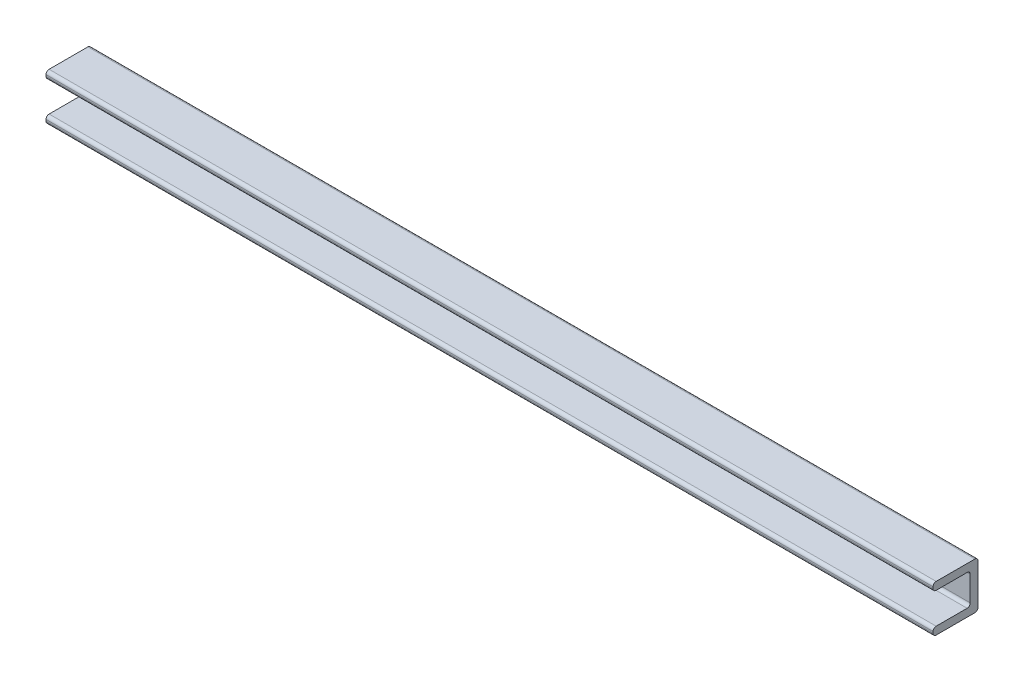
ISO-10303-21;
HEADER;
FILE_DESCRIPTION(('STEP AP214'),'2;1');
FILE_NAME('part.step','',(''),(''),'','','');
FILE_SCHEMA(('AUTOMOTIVE_DESIGN { 1 0 10303 214 1 1 1 1 }'));
ENDSEC;
DATA;
#1=APPLICATION_CONTEXT('core data for automotive mechanical design processes');
#2=APPLICATION_PROTOCOL_DEFINITION('international standard','automotive_design',2000,#1);
#3=PRODUCT_CONTEXT('',#1,'mechanical');
#4=PRODUCT('Part','Part','',(#3));
#5=PRODUCT_RELATED_PRODUCT_CATEGORY('part','',(#4));
#6=PRODUCT_DEFINITION_FORMATION('','',#4);
#7=PRODUCT_DEFINITION_CONTEXT('part definition',#1,'design');
#8=PRODUCT_DEFINITION('design','',#6,#7);
#9=PRODUCT_DEFINITION_SHAPE('','',#8);
#10=(LENGTH_UNIT() NAMED_UNIT(*) SI_UNIT(.MILLI.,.METRE.));
#11=(NAMED_UNIT(*) PLANE_ANGLE_UNIT() SI_UNIT($,.RADIAN.));
#12=(NAMED_UNIT(*) SI_UNIT($,.STERADIAN.) SOLID_ANGLE_UNIT());
#13=UNCERTAINTY_MEASURE_WITH_UNIT(LENGTH_MEASURE(1.E-05),#10,'distance_accuracy_value','');
#14=(GEOMETRIC_REPRESENTATION_CONTEXT(3) GLOBAL_UNCERTAINTY_ASSIGNED_CONTEXT((#13)) GLOBAL_UNIT_ASSIGNED_CONTEXT((#10,
#11,#12)) REPRESENTATION_CONTEXT('',''));
#15=CARTESIAN_POINT('',(0.,0.,0.));
#16=DIRECTION('',(0.,0.,1.));
#17=DIRECTION('',(1.,0.,0.));
#18=AXIS2_PLACEMENT_3D('',#15,#16,#17);
#19=CARTESIAN_POINT('',(602.,8.00000000000133,-188.));
#20=DIRECTION('',(-1.,0.,0.));
#21=DIRECTION('',(0.,0.,1.));
#22=AXIS2_PLACEMENT_3D('',#19,#20,#21);
#23=CYLINDRICAL_SURFACE('',#22,2.);
#24=CARTESIAN_POINT('',(30.,8.00000000000133,-188.));
#25=DIRECTION('',(-1.,0.,0.));
#26=DIRECTION('',(0.,0.,-1.));
#27=AXIS2_PLACEMENT_3D('',#24,#25,#26);
#28=CIRCLE('',#27,2.);
#29=CARTESIAN_POINT('',(30.,10.0000000000013,-188.));
#30=VERTEX_POINT('',#29);
#31=CARTESIAN_POINT('',(30.,8.00000000000133,-190.));
#32=VERTEX_POINT('',#31);
#33=EDGE_CURVE('E188',#30,#32,#28,.T.);
#34=ORIENTED_EDGE('',*,*,#33,.T.);
#35=DIRECTION('',(-1.,0.,0.));
#36=VECTOR('',#35,1.);
#37=CARTESIAN_POINT('',(602.,8.00000000000133,-190.));
#38=LINE('',#37,#36);
#39=CARTESIAN_POINT('',(602.,8.00000000000133,-190.));
#40=VERTEX_POINT('',#39);
#41=EDGE_CURVE('E11',#40,#32,#38,.T.);
#42=ORIENTED_EDGE('',*,*,#41,.F.);
#43=CARTESIAN_POINT('',(602.,8.00000000000133,-188.));
#44=DIRECTION('',(-1.,0.,0.));
#45=DIRECTION('',(0.,0.,-1.));
#46=AXIS2_PLACEMENT_3D('',#43,#44,#45);
#47=CIRCLE('',#46,2.);
#48=CARTESIAN_POINT('',(602.,10.0000000000013,-188.));
#49=VERTEX_POINT('',#48);
#50=EDGE_CURVE('E234',#49,#40,#47,.T.);
#51=ORIENTED_EDGE('',*,*,#50,.F.);
#52=DIRECTION('',(-1.,0.,0.));
#53=VECTOR('',#52,1.);
#54=CARTESIAN_POINT('',(602.,10.0000000000013,-188.));
#55=LINE('',#54,#53);
#56=EDGE_CURVE('E184',#49,#30,#55,.T.);
#57=ORIENTED_EDGE('',*,*,#56,.T.);
#58=EDGE_LOOP('',(#34,#42,#51,#57));
#59=FACE_BOUND('',#58,.T.);
#60=ADVANCED_FACE('F38',(#59),#23,.F.);
#61=CARTESIAN_POINT('',(602.,8.00000000000133,-190.));
#62=DIRECTION('',(0.,0.,-1.));
#63=DIRECTION('',(0.,1.,0.));
#64=AXIS2_PLACEMENT_3D('',#61,#62,#63);
#65=PLANE('',#64);
#66=DIRECTION('',(0.,-1.,0.));
#67=VECTOR('',#66,1.);
#68=CARTESIAN_POINT('',(30.,8.00000000000133,-190.));
#69=LINE('',#68,#67);
#70=CARTESIAN_POINT('',(30.,-7.99999999999866,-190.));
#71=VERTEX_POINT('',#70);
#72=EDGE_CURVE('E192',#32,#71,#69,.T.);
#73=ORIENTED_EDGE('',*,*,#72,.T.);
#74=DIRECTION('',(-1.,0.,0.));
#75=VECTOR('',#74,1.);
#76=CARTESIAN_POINT('',(602.,-7.99999999999866,-190.));
#77=LINE('',#76,#75);
#78=CARTESIAN_POINT('',(602.,-7.99999999999866,-190.));
#79=VERTEX_POINT('',#78);
#80=EDGE_CURVE('E47',#79,#71,#77,.T.);
#81=ORIENTED_EDGE('',*,*,#80,.F.);
#82=DIRECTION('',(0.,-1.,0.));
#83=VECTOR('',#82,1.);
#84=CARTESIAN_POINT('',(602.,8.00000000000133,-190.));
#85=LINE('',#84,#83);
#86=EDGE_CURVE('E122',#40,#79,#85,.T.);
#87=ORIENTED_EDGE('',*,*,#86,.F.);
#88=ORIENTED_EDGE('',*,*,#41,.T.);
#89=EDGE_LOOP('',(#73,#81,#87,#88));
#90=FACE_BOUND('',#89,.T.);
#91=ADVANCED_FACE('F367',(#90),#65,.F.);
#92=CARTESIAN_POINT('',(602.,-7.99999999999866,-188.));
#93=DIRECTION('',(-1.,0.,0.));
#94=DIRECTION('',(0.,0.,1.));
#95=AXIS2_PLACEMENT_3D('',#92,#93,#94);
#96=CYLINDRICAL_SURFACE('',#95,2.);
#97=CARTESIAN_POINT('',(30.,-7.99999999999866,-188.));
#98=DIRECTION('',(-1.,0.,0.));
#99=DIRECTION('',(0.,0.,-1.));
#100=AXIS2_PLACEMENT_3D('',#97,#98,#99);
#101=CIRCLE('',#100,2.);
#102=CARTESIAN_POINT('',(30.,-9.99999999999867,-188.));
#103=VERTEX_POINT('',#102);
#104=EDGE_CURVE('E195',#71,#103,#101,.T.);
#105=ORIENTED_EDGE('',*,*,#104,.T.);
#106=DIRECTION('',(-1.,0.,0.));
#107=VECTOR('',#106,1.);
#108=CARTESIAN_POINT('',(602.,-9.99999999999867,-188.));
#109=LINE('',#108,#107);
#110=CARTESIAN_POINT('',(602.,-9.99999999999867,-188.));
#111=VERTEX_POINT('',#110);
#112=EDGE_CURVE('E277',#111,#103,#109,.T.);
#113=ORIENTED_EDGE('',*,*,#112,.F.);
#114=CARTESIAN_POINT('',(602.,-7.99999999999866,-188.));
#115=DIRECTION('',(-1.,0.,0.));
#116=DIRECTION('',(0.,0.,-1.));
#117=AXIS2_PLACEMENT_3D('',#114,#115,#116);
#118=CIRCLE('',#117,2.);
#119=EDGE_CURVE('E288',#79,#111,#118,.T.);
#120=ORIENTED_EDGE('',*,*,#119,.F.);
#121=ORIENTED_EDGE('',*,*,#80,.T.);
#122=EDGE_LOOP('',(#105,#113,#120,#121));
#123=FACE_BOUND('',#122,.T.);
#124=ADVANCED_FACE('F286',(#123),#96,.F.);
#125=CARTESIAN_POINT('',(602.,-9.99999999999867,-188.));
#126=DIRECTION('',(0.,-1.,0.));
#127=DIRECTION('',(0.,0.,-1.));
#128=AXIS2_PLACEMENT_3D('',#125,#126,#127);
#129=PLANE('',#128);
#130=DIRECTION('',(0.,0.,1.));
#131=VECTOR('',#130,1.);
#132=CARTESIAN_POINT('',(30.,-9.99999999999867,-188.));
#133=LINE('',#132,#131);
#134=CARTESIAN_POINT('',(30.,-9.99999999999889,-168.));
#135=VERTEX_POINT('',#134);
#136=EDGE_CURVE('E198',#103,#135,#133,.T.);
#137=ORIENTED_EDGE('',*,*,#136,.T.);
#138=DIRECTION('',(-1.,0.,0.));
#139=VECTOR('',#138,1.);
#140=CARTESIAN_POINT('',(602.,-9.99999999999889,-168.));
#141=LINE('',#140,#139);
#142=CARTESIAN_POINT('',(602.,-9.99999999999889,-168.));
#143=VERTEX_POINT('',#142);
#144=EDGE_CURVE('E273',#143,#135,#141,.T.);
#145=ORIENTED_EDGE('',*,*,#144,.F.);
#146=DIRECTION('',(0.,0.,1.));
#147=VECTOR('',#146,1.);
#148=CARTESIAN_POINT('',(602.,-9.99999999999867,-188.));
#149=LINE('',#148,#147);
#150=EDGE_CURVE('E307',#111,#143,#149,.T.);
#151=ORIENTED_EDGE('',*,*,#150,.F.);
#152=ORIENTED_EDGE('',*,*,#112,.T.);
#153=EDGE_LOOP('',(#137,#145,#151,#152));
#154=FACE_BOUND('',#153,.T.);
#155=ADVANCED_FACE('F297',(#154),#129,.F.);
#156=CARTESIAN_POINT('',(602.,-11.9999999999989,-168.));
#157=DIRECTION('',(-1.,0.,0.));
#158=DIRECTION('',(0.,0.,1.));
#159=AXIS2_PLACEMENT_3D('',#156,#157,#158);
#160=CYLINDRICAL_SURFACE('',#159,2.);
#161=CARTESIAN_POINT('',(30.,-11.9999999999989,-168.));
#162=DIRECTION('',(1.,0.,0.));
#163=DIRECTION('',(0.,0.,-1.));
#164=AXIS2_PLACEMENT_3D('',#161,#162,#163);
#165=CIRCLE('',#164,2.);
#166=CARTESIAN_POINT('',(30.,-11.9999999999989,-166.));
#167=VERTEX_POINT('',#166);
#168=EDGE_CURVE('E201',#135,#167,#165,.T.);
#169=ORIENTED_EDGE('',*,*,#168,.T.);
#170=DIRECTION('',(-1.,0.,0.));
#171=VECTOR('',#170,1.);
#172=CARTESIAN_POINT('',(602.,-11.9999999999989,-166.));
#173=LINE('',#172,#171);
#174=CARTESIAN_POINT('',(602.,-11.9999999999989,-166.));
#175=VERTEX_POINT('',#174);
#176=EDGE_CURVE('E269',#175,#167,#173,.T.);
#177=ORIENTED_EDGE('',*,*,#176,.F.);
#178=CARTESIAN_POINT('',(602.,-11.9999999999989,-168.));
#179=DIRECTION('',(1.,0.,0.));
#180=DIRECTION('',(0.,0.,-1.));
#181=AXIS2_PLACEMENT_3D('',#178,#179,#180);
#182=CIRCLE('',#181,2.);
#183=EDGE_CURVE('E303',#143,#175,#182,.T.);
#184=ORIENTED_EDGE('',*,*,#183,.F.);
#185=ORIENTED_EDGE('',*,*,#144,.T.);
#186=EDGE_LOOP('',(#169,#177,#184,#185));
#187=FACE_BOUND('',#186,.T.);
#188=ADVANCED_FACE('F301',(#187),#160,.T.);
#189=CARTESIAN_POINT('',(602.,-11.9999999999989,-166.));
#190=DIRECTION('',(0.,0.,-1.));
#191=DIRECTION('',(-1.,0.,0.));
#192=AXIS2_PLACEMENT_3D('',#189,#190,#191);
#193=PLANE('',#192);
#194=DIRECTION('',(0.,-1.,0.));
#195=VECTOR('',#194,1.);
#196=CARTESIAN_POINT('',(30.,-11.9999999999989,-166.));
#197=LINE('',#196,#195);
#198=CARTESIAN_POINT('',(30.,-12.9999999999989,-166.));
#199=VERTEX_POINT('',#198);
#200=EDGE_CURVE('E204',#167,#199,#197,.T.);
#201=ORIENTED_EDGE('',*,*,#200,.T.);
#202=DIRECTION('',(-1.,0.,0.));
#203=VECTOR('',#202,1.);
#204=CARTESIAN_POINT('',(602.,-12.9999999999989,-166.));
#205=LINE('',#204,#203);
#206=CARTESIAN_POINT('',(602.,-12.9999999999989,-166.));
#207=VERTEX_POINT('',#206);
#208=EDGE_CURVE('E265',#207,#199,#205,.T.);
#209=ORIENTED_EDGE('',*,*,#208,.F.);
#210=DIRECTION('',(0.,-1.,0.));
#211=VECTOR('',#210,1.);
#212=CARTESIAN_POINT('',(602.,-11.9999999999989,-166.));
#213=LINE('',#212,#211);
#214=EDGE_CURVE('E306',#175,#207,#213,.T.);
#215=ORIENTED_EDGE('',*,*,#214,.F.);
#216=ORIENTED_EDGE('',*,*,#176,.T.);
#217=EDGE_LOOP('',(#201,#209,#215,#216));
#218=FACE_BOUND('',#217,.T.);
#219=ADVANCED_FACE('F380',(#218),#193,.F.);
#220=CARTESIAN_POINT('',(602.,-12.9999999999989,-168.));
#221=DIRECTION('',(-1.,0.,0.));
#222=DIRECTION('',(0.,0.,1.));
#223=AXIS2_PLACEMENT_3D('',#220,#221,#222);
#224=CYLINDRICAL_SURFACE('',#223,2.00000000000001);
#225=CARTESIAN_POINT('',(30.,-12.9999999999989,-168.));
#226=DIRECTION('',(1.,0.,0.));
#227=DIRECTION('',(0.,0.,-1.));
#228=AXIS2_PLACEMENT_3D('',#225,#226,#227);
#229=CIRCLE('',#228,2.00000000000001);
#230=CARTESIAN_POINT('',(30.,-14.9999999999989,-168.));
#231=VERTEX_POINT('',#230);
#232=EDGE_CURVE('E207',#199,#231,#229,.T.);
#233=ORIENTED_EDGE('',*,*,#232,.T.);
#234=DIRECTION('',(-1.,0.,0.));
#235=VECTOR('',#234,1.);
#236=CARTESIAN_POINT('',(602.,-14.9999999999989,-168.));
#237=LINE('',#236,#235);
#238=CARTESIAN_POINT('',(602.,-14.9999999999989,-168.));
#239=VERTEX_POINT('',#238);
#240=EDGE_CURVE('E261',#239,#231,#237,.T.);
#241=ORIENTED_EDGE('',*,*,#240,.F.);
#242=CARTESIAN_POINT('',(602.,-12.9999999999989,-168.));
#243=DIRECTION('',(1.,0.,0.));
#244=DIRECTION('',(0.,0.,-1.));
#245=AXIS2_PLACEMENT_3D('',#242,#243,#244);
#246=CIRCLE('',#245,2.00000000000001);
#247=EDGE_CURVE('E312',#207,#239,#246,.T.);
#248=ORIENTED_EDGE('',*,*,#247,.F.);
#249=ORIENTED_EDGE('',*,*,#208,.T.);
#250=EDGE_LOOP('',(#233,#241,#248,#249));
#251=FACE_BOUND('',#250,.T.);
#252=ADVANCED_FACE('F383',(#251),#224,.T.);
#253=CARTESIAN_POINT('',(602.,-14.9999999999987,-193.));
#254=DIRECTION('',(0.,1.,0.));
#255=DIRECTION('',(0.,0.,1.));
#256=AXIS2_PLACEMENT_3D('',#253,#254,#255);
#257=PLANE('',#256);
#258=DIRECTION('',(0.,0.,-1.));
#259=VECTOR('',#258,1.);
#260=CARTESIAN_POINT('',(30.,-14.9999999999987,-193.));
#261=LINE('',#260,#259);
#262=CARTESIAN_POINT('',(30.,-14.9999999999987,-193.));
#263=VERTEX_POINT('',#262);
#264=EDGE_CURVE('E210',#231,#263,#261,.T.);
#265=ORIENTED_EDGE('',*,*,#264,.T.);
#266=DIRECTION('',(-1.,0.,0.));
#267=VECTOR('',#266,1.);
#268=CARTESIAN_POINT('',(602.,-14.9999999999987,-193.));
#269=LINE('',#268,#267);
#270=CARTESIAN_POINT('',(602.,-14.9999999999987,-193.));
#271=VERTEX_POINT('',#270);
#272=EDGE_CURVE('E257',#271,#263,#269,.T.);
#273=ORIENTED_EDGE('',*,*,#272,.F.);
#274=DIRECTION('',(0.,0.,-1.));
#275=VECTOR('',#274,1.);
#276=CARTESIAN_POINT('',(602.,-14.9999999999987,-193.));
#277=LINE('',#276,#275);
#278=EDGE_CURVE('E319',#239,#271,#277,.T.);
#279=ORIENTED_EDGE('',*,*,#278,.F.);
#280=ORIENTED_EDGE('',*,*,#240,.T.);
#281=EDGE_LOOP('',(#265,#273,#279,#280));
#282=FACE_BOUND('',#281,.T.);
#283=ADVANCED_FACE('F387',(#282),#257,.F.);
#284=CARTESIAN_POINT('',(602.,-12.9999999999987,-193.));
#285=DIRECTION('',(-1.,0.,0.));
#286=DIRECTION('',(0.,0.,1.));
#287=AXIS2_PLACEMENT_3D('',#284,#285,#286);
#288=CYLINDRICAL_SURFACE('',#287,2.);
#289=CARTESIAN_POINT('',(30.,-12.9999999999987,-193.));
#290=DIRECTION('',(1.,0.,0.));
#291=DIRECTION('',(0.,0.,-1.));
#292=AXIS2_PLACEMENT_3D('',#289,#290,#291);
#293=CIRCLE('',#292,2.);
#294=CARTESIAN_POINT('',(30.,-12.9999999999987,-195.));
#295=VERTEX_POINT('',#294);
#296=EDGE_CURVE('E213',#263,#295,#293,.T.);
#297=ORIENTED_EDGE('',*,*,#296,.T.);
#298=DIRECTION('',(-1.,0.,0.));
#299=VECTOR('',#298,1.);
#300=CARTESIAN_POINT('',(602.,-12.9999999999987,-195.));
#301=LINE('',#300,#299);
#302=CARTESIAN_POINT('',(602.,-12.9999999999987,-195.));
#303=VERTEX_POINT('',#302);
#304=EDGE_CURVE('E253',#303,#295,#301,.T.);
#305=ORIENTED_EDGE('',*,*,#304,.F.);
#306=CARTESIAN_POINT('',(602.,-12.9999999999987,-193.));
#307=DIRECTION('',(1.,0.,0.));
#308=DIRECTION('',(0.,0.,-1.));
#309=AXIS2_PLACEMENT_3D('',#306,#307,#308);
#310=CIRCLE('',#309,2.);
#311=EDGE_CURVE('E322',#271,#303,#310,.T.);
#312=ORIENTED_EDGE('',*,*,#311,.F.);
#313=ORIENTED_EDGE('',*,*,#272,.T.);
#314=EDGE_LOOP('',(#297,#305,#312,#313));
#315=FACE_BOUND('',#314,.T.);
#316=ADVANCED_FACE('F391',(#315),#288,.T.);
#317=CARTESIAN_POINT('',(602.,13.0000000000013,-195.));
#318=DIRECTION('',(0.,0.,1.));
#319=DIRECTION('',(0.,-1.,0.));
#320=AXIS2_PLACEMENT_3D('',#317,#318,#319);
#321=PLANE('',#320);
#322=DIRECTION('',(0.,1.,0.));
#323=VECTOR('',#322,1.);
#324=CARTESIAN_POINT('',(30.,13.0000000000013,-195.));
#325=LINE('',#324,#323);
#326=CARTESIAN_POINT('',(30.,13.0000000000013,-195.));
#327=VERTEX_POINT('',#326);
#328=EDGE_CURVE('E216',#295,#327,#325,.T.);
#329=ORIENTED_EDGE('',*,*,#328,.T.);
#330=DIRECTION('',(-1.,0.,0.));
#331=VECTOR('',#330,1.);
#332=CARTESIAN_POINT('',(602.,13.0000000000013,-195.));
#333=LINE('',#332,#331);
#334=CARTESIAN_POINT('',(602.,13.0000000000013,-195.));
#335=VERTEX_POINT('',#334);
#336=EDGE_CURVE('E249',#335,#327,#333,.T.);
#337=ORIENTED_EDGE('',*,*,#336,.F.);
#338=DIRECTION('',(0.,1.,0.));
#339=VECTOR('',#338,1.);
#340=CARTESIAN_POINT('',(602.,13.0000000000013,-195.));
#341=LINE('',#340,#339);
#342=EDGE_CURVE('E325',#303,#335,#341,.T.);
#343=ORIENTED_EDGE('',*,*,#342,.F.);
#344=ORIENTED_EDGE('',*,*,#304,.T.);
#345=EDGE_LOOP('',(#329,#337,#343,#344));
#346=FACE_BOUND('',#345,.T.);
#347=ADVANCED_FACE('F395',(#346),#321,.F.);
#348=CARTESIAN_POINT('',(602.,13.0000000000013,-193.));
#349=DIRECTION('',(-1.,0.,0.));
#350=DIRECTION('',(0.,0.,1.));
#351=AXIS2_PLACEMENT_3D('',#348,#349,#350);
#352=CYLINDRICAL_SURFACE('',#351,2.);
#353=CARTESIAN_POINT('',(30.,13.0000000000013,-193.));
#354=DIRECTION('',(1.,0.,0.));
#355=DIRECTION('',(0.,0.,-1.));
#356=AXIS2_PLACEMENT_3D('',#353,#354,#355);
#357=CIRCLE('',#356,2.);
#358=CARTESIAN_POINT('',(30.,15.0000000000013,-193.));
#359=VERTEX_POINT('',#358);
#360=EDGE_CURVE('E219',#327,#359,#357,.T.);
#361=ORIENTED_EDGE('',*,*,#360,.T.);
#362=DIRECTION('',(-1.,0.,0.));
#363=VECTOR('',#362,1.);
#364=CARTESIAN_POINT('',(602.,15.0000000000013,-193.));
#365=LINE('',#364,#363);
#366=CARTESIAN_POINT('',(602.,15.0000000000013,-193.));
#367=VERTEX_POINT('',#366);
#368=EDGE_CURVE('E245',#367,#359,#365,.T.);
#369=ORIENTED_EDGE('',*,*,#368,.F.);
#370=CARTESIAN_POINT('',(602.,13.0000000000013,-193.));
#371=DIRECTION('',(1.,0.,0.));
#372=DIRECTION('',(0.,0.,-1.));
#373=AXIS2_PLACEMENT_3D('',#370,#371,#372);
#374=CIRCLE('',#373,2.);
#375=EDGE_CURVE('E328',#335,#367,#374,.T.);
#376=ORIENTED_EDGE('',*,*,#375,.F.);
#377=ORIENTED_EDGE('',*,*,#336,.T.);
#378=EDGE_LOOP('',(#361,#369,#376,#377));
#379=FACE_BOUND('',#378,.T.);
#380=ADVANCED_FACE('F399',(#379),#352,.T.);
#381=CARTESIAN_POINT('',(602.,15.0000000000013,-168.));
#382=DIRECTION('',(0.,-1.,0.));
#383=DIRECTION('',(0.,0.,-1.));
#384=AXIS2_PLACEMENT_3D('',#381,#382,#383);
#385=PLANE('',#384);
#386=DIRECTION('',(0.,0.,1.));
#387=VECTOR('',#386,1.);
#388=CARTESIAN_POINT('',(30.,15.0000000000013,-168.));
#389=LINE('',#388,#387);
#390=CARTESIAN_POINT('',(30.,15.0000000000013,-168.));
#391=VERTEX_POINT('',#390);
#392=EDGE_CURVE('E222',#359,#391,#389,.T.);
#393=ORIENTED_EDGE('',*,*,#392,.T.);
#394=DIRECTION('',(-1.,0.,0.));
#395=VECTOR('',#394,1.);
#396=CARTESIAN_POINT('',(602.,15.0000000000013,-168.));
#397=LINE('',#396,#395);
#398=CARTESIAN_POINT('',(602.,15.0000000000013,-168.));
#399=VERTEX_POINT('',#398);
#400=EDGE_CURVE('E241',#399,#391,#397,.T.);
#401=ORIENTED_EDGE('',*,*,#400,.F.);
#402=DIRECTION('',(0.,0.,1.));
#403=VECTOR('',#402,1.);
#404=CARTESIAN_POINT('',(602.,15.0000000000013,-168.));
#405=LINE('',#404,#403);
#406=EDGE_CURVE('E331',#367,#399,#405,.T.);
#407=ORIENTED_EDGE('',*,*,#406,.F.);
#408=ORIENTED_EDGE('',*,*,#368,.T.);
#409=EDGE_LOOP('',(#393,#401,#407,#408));
#410=FACE_BOUND('',#409,.T.);
#411=ADVANCED_FACE('F348',(#410),#385,.F.);
#412=CARTESIAN_POINT('',(602.,13.0000000000013,-168.));
#413=DIRECTION('',(-1.,0.,0.));
#414=DIRECTION('',(0.,0.,1.));
#415=AXIS2_PLACEMENT_3D('',#412,#413,#414);
#416=CYLINDRICAL_SURFACE('',#415,2.00000000000001);
#417=CARTESIAN_POINT('',(30.,13.0000000000013,-168.));
#418=DIRECTION('',(1.,0.,0.));
#419=DIRECTION('',(0.,0.,-1.));
#420=AXIS2_PLACEMENT_3D('',#417,#418,#419);
#421=CIRCLE('',#420,2.00000000000001);
#422=CARTESIAN_POINT('',(30.,13.0000000000013,-166.));
#423=VERTEX_POINT('',#422);
#424=EDGE_CURVE('E225',#391,#423,#421,.T.);
#425=ORIENTED_EDGE('',*,*,#424,.T.);
#426=DIRECTION('',(-1.,0.,0.));
#427=VECTOR('',#426,1.);
#428=CARTESIAN_POINT('',(602.,13.0000000000013,-166.));
#429=LINE('',#428,#427);
#430=CARTESIAN_POINT('',(602.,13.0000000000013,-166.));
#431=VERTEX_POINT('',#430);
#432=EDGE_CURVE('E176',#431,#423,#429,.T.);
#433=ORIENTED_EDGE('',*,*,#432,.F.);
#434=CARTESIAN_POINT('',(602.,13.0000000000013,-168.));
#435=DIRECTION('',(1.,0.,0.));
#436=DIRECTION('',(0.,0.,-1.));
#437=AXIS2_PLACEMENT_3D('',#434,#435,#436);
#438=CIRCLE('',#437,2.00000000000001);
#439=EDGE_CURVE('E165',#399,#431,#438,.T.);
#440=ORIENTED_EDGE('',*,*,#439,.F.);
#441=ORIENTED_EDGE('',*,*,#400,.T.);
#442=EDGE_LOOP('',(#425,#433,#440,#441));
#443=FACE_BOUND('',#442,.T.);
#444=ADVANCED_FACE('F352',(#443),#416,.T.);
#445=CARTESIAN_POINT('',(602.,13.0000000000013,-166.));
#446=DIRECTION('',(0.,0.,-1.));
#447=DIRECTION('',(-1.,0.,0.));
#448=AXIS2_PLACEMENT_3D('',#445,#446,#447);
#449=PLANE('',#448);
#450=DIRECTION('',(0.,-1.,0.));
#451=VECTOR('',#450,1.);
#452=CARTESIAN_POINT('',(30.,13.0000000000013,-166.));
#453=LINE('',#452,#451);
#454=CARTESIAN_POINT('',(30.,12.0000000000013,-166.));
#455=VERTEX_POINT('',#454);
#456=EDGE_CURVE('E174',#423,#455,#453,.T.);
#457=ORIENTED_EDGE('',*,*,#456,.T.);
#458=DIRECTION('',(-1.,0.,0.));
#459=VECTOR('',#458,1.);
#460=CARTESIAN_POINT('',(602.,12.0000000000013,-166.));
#461=LINE('',#460,#459);
#462=CARTESIAN_POINT('',(602.,12.0000000000013,-166.));
#463=VERTEX_POINT('',#462);
#464=EDGE_CURVE('E171',#463,#455,#461,.T.);
#465=ORIENTED_EDGE('',*,*,#464,.F.);
#466=DIRECTION('',(0.,-1.,0.));
#467=VECTOR('',#466,1.);
#468=CARTESIAN_POINT('',(602.,13.0000000000013,-166.));
#469=LINE('',#468,#467);
#470=EDGE_CURVE('E159',#431,#463,#469,.T.);
#471=ORIENTED_EDGE('',*,*,#470,.F.);
#472=ORIENTED_EDGE('',*,*,#432,.T.);
#473=EDGE_LOOP('',(#457,#465,#471,#472));
#474=FACE_BOUND('',#473,.T.);
#475=ADVANCED_FACE('F172',(#474),#449,.F.);
#476=CARTESIAN_POINT('',(602.,12.0000000000013,-168.));
#477=DIRECTION('',(-1.,0.,0.));
#478=DIRECTION('',(0.,0.,1.));
#479=AXIS2_PLACEMENT_3D('',#476,#477,#478);
#480=CYLINDRICAL_SURFACE('',#479,2.);
#481=CARTESIAN_POINT('',(30.,12.0000000000013,-168.));
#482=DIRECTION('',(1.,0.,0.));
#483=DIRECTION('',(0.,0.,-1.));
#484=AXIS2_PLACEMENT_3D('',#481,#482,#483);
#485=CIRCLE('',#484,2.);
#486=CARTESIAN_POINT('',(30.,10.0000000000013,-168.));
#487=VERTEX_POINT('',#486);
#488=EDGE_CURVE('E108',#455,#487,#485,.T.);
#489=ORIENTED_EDGE('',*,*,#488,.T.);
#490=DIRECTION('',(-1.,0.,0.));
#491=VECTOR('',#490,1.);
#492=CARTESIAN_POINT('',(602.,10.0000000000013,-168.));
#493=LINE('',#492,#491);
#494=CARTESIAN_POINT('',(602.,10.0000000000013,-168.));
#495=VERTEX_POINT('',#494);
#496=EDGE_CURVE('E177',#495,#487,#493,.T.);
#497=ORIENTED_EDGE('',*,*,#496,.F.);
#498=CARTESIAN_POINT('',(602.,12.0000000000013,-168.));
#499=DIRECTION('',(1.,0.,0.));
#500=DIRECTION('',(0.,0.,-1.));
#501=AXIS2_PLACEMENT_3D('',#498,#499,#500);
#502=CIRCLE('',#501,2.);
#503=EDGE_CURVE('E163',#463,#495,#502,.T.);
#504=ORIENTED_EDGE('',*,*,#503,.F.);
#505=ORIENTED_EDGE('',*,*,#464,.T.);
#506=EDGE_LOOP('',(#489,#497,#504,#505));
#507=FACE_BOUND('',#506,.T.);
#508=ADVANCED_FACE('F179',(#507),#480,.T.);
#509=CARTESIAN_POINT('',(602.,10.0000000000013,-168.));
#510=DIRECTION('',(0.,1.,0.));
#511=DIRECTION('',(0.,0.,1.));
#512=AXIS2_PLACEMENT_3D('',#509,#510,#511);
#513=PLANE('',#512);
#514=DIRECTION('',(0.,0.,-1.));
#515=VECTOR('',#514,1.);
#516=CARTESIAN_POINT('',(30.,10.0000000000013,-168.));
#517=LINE('',#516,#515);
#518=EDGE_CURVE('E114',#487,#30,#517,.T.);
#519=ORIENTED_EDGE('',*,*,#518,.T.);
#520=ORIENTED_EDGE('',*,*,#56,.F.);
#521=DIRECTION('',(0.,0.,-1.));
#522=VECTOR('',#521,1.);
#523=CARTESIAN_POINT('',(602.,10.0000000000013,-168.));
#524=LINE('',#523,#522);
#525=EDGE_CURVE('E55',#495,#49,#524,.T.);
#526=ORIENTED_EDGE('',*,*,#525,.F.);
#527=ORIENTED_EDGE('',*,*,#496,.T.);
#528=EDGE_LOOP('',(#519,#520,#526,#527));
#529=FACE_BOUND('',#528,.T.);
#530=ADVANCED_FACE('F356',(#529),#513,.F.);
#531=CARTESIAN_POINT('',(602.,8.00000000000133,-188.));
#532=DIRECTION('',(1.,0.,0.));
#533=DIRECTION('',(0.,0.,-1.));
#534=AXIS2_PLACEMENT_3D('',#531,#532,#533);
#535=PLANE('',#534);
#536=ORIENTED_EDGE('',*,*,#50,.T.);
#537=ORIENTED_EDGE('',*,*,#86,.T.);
#538=ORIENTED_EDGE('',*,*,#119,.T.);
#539=ORIENTED_EDGE('',*,*,#150,.T.);
#540=ORIENTED_EDGE('',*,*,#183,.T.);
#541=ORIENTED_EDGE('',*,*,#214,.T.);
#542=ORIENTED_EDGE('',*,*,#247,.T.);
#543=ORIENTED_EDGE('',*,*,#278,.T.);
#544=ORIENTED_EDGE('',*,*,#311,.T.);
#545=ORIENTED_EDGE('',*,*,#342,.T.);
#546=ORIENTED_EDGE('',*,*,#375,.T.);
#547=ORIENTED_EDGE('',*,*,#406,.T.);
#548=ORIENTED_EDGE('',*,*,#439,.T.);
#549=ORIENTED_EDGE('',*,*,#470,.T.);
#550=ORIENTED_EDGE('',*,*,#503,.T.);
#551=ORIENTED_EDGE('',*,*,#525,.T.);
#552=EDGE_LOOP('',(#536,#537,#538,#539,#540,#541,#542,#543,#544,#545,#546,#547,#548,#549,#550,#551));
#553=FACE_BOUND('',#552,.T.);
#554=ADVANCED_FACE('F161',(#553),#535,.T.);
#555=CARTESIAN_POINT('',(30.,8.00000000000133,-188.));
#556=DIRECTION('',(1.,0.,0.));
#557=DIRECTION('',(0.,0.,-1.));
#558=AXIS2_PLACEMENT_3D('',#555,#556,#557);
#559=PLANE('',#558);
#560=ORIENTED_EDGE('',*,*,#33,.F.);
#561=ORIENTED_EDGE('',*,*,#518,.F.);
#562=ORIENTED_EDGE('',*,*,#488,.F.);
#563=ORIENTED_EDGE('',*,*,#456,.F.);
#564=ORIENTED_EDGE('',*,*,#424,.F.);
#565=ORIENTED_EDGE('',*,*,#392,.F.);
#566=ORIENTED_EDGE('',*,*,#360,.F.);
#567=ORIENTED_EDGE('',*,*,#328,.F.);
#568=ORIENTED_EDGE('',*,*,#296,.F.);
#569=ORIENTED_EDGE('',*,*,#264,.F.);
#570=ORIENTED_EDGE('',*,*,#232,.F.);
#571=ORIENTED_EDGE('',*,*,#200,.F.);
#572=ORIENTED_EDGE('',*,*,#168,.F.);
#573=ORIENTED_EDGE('',*,*,#136,.F.);
#574=ORIENTED_EDGE('',*,*,#104,.F.);
#575=ORIENTED_EDGE('',*,*,#72,.F.);
#576=EDGE_LOOP('',(#560,#561,#562,#563,#564,#565,#566,#567,#568,#569,#570,#571,#572,#573,#574,#575));
#577=FACE_BOUND('',#576,.T.);
#578=ADVANCED_FACE('F292',(#577),#559,.F.);
#579=CLOSED_SHELL('',(#60,#91,#124,#155,#188,#219,#252,#283,#316,#347,#380,#411,#444,#475,#508,
#530,#554,#578));
#580=MANIFOLD_SOLID_BREP('B2',#579);
#581=ADVANCED_BREP_SHAPE_REPRESENTATION('',(#18,#580),#14);
#582=SHAPE_DEFINITION_REPRESENTATION(#9,#581);
ENDSEC;
END-ISO-10303-21;
